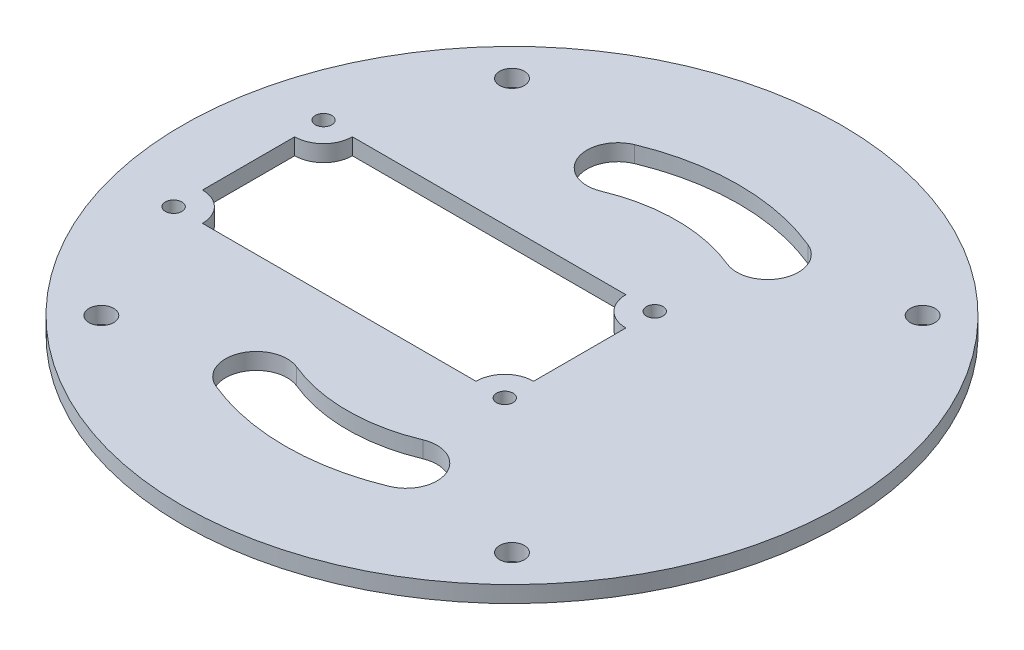
ISO-10303-21;
HEADER;
FILE_DESCRIPTION(('STEP AP214'),'2;1');
FILE_NAME('part.step','',(''),(''),'','','');
FILE_SCHEMA(('AUTOMOTIVE_DESIGN { 1 0 10303 214 1 1 1 1 }'));
ENDSEC;
DATA;
#1=APPLICATION_CONTEXT('core data for automotive mechanical design processes');
#2=APPLICATION_PROTOCOL_DEFINITION('international standard','automotive_design',2000,#1);
#3=PRODUCT_CONTEXT('',#1,'mechanical');
#4=PRODUCT('Part','Part','',(#3));
#5=PRODUCT_RELATED_PRODUCT_CATEGORY('part','',(#4));
#6=PRODUCT_DEFINITION_FORMATION('','',#4);
#7=PRODUCT_DEFINITION_CONTEXT('part definition',#1,'design');
#8=PRODUCT_DEFINITION('design','',#6,#7);
#9=PRODUCT_DEFINITION_SHAPE('','',#8);
#10=(LENGTH_UNIT() NAMED_UNIT(*) SI_UNIT(.MILLI.,.METRE.));
#11=(NAMED_UNIT(*) PLANE_ANGLE_UNIT() SI_UNIT($,.RADIAN.));
#12=(NAMED_UNIT(*) SI_UNIT($,.STERADIAN.) SOLID_ANGLE_UNIT());
#13=UNCERTAINTY_MEASURE_WITH_UNIT(LENGTH_MEASURE(1.E-05),#10,'distance_accuracy_value','');
#14=(GEOMETRIC_REPRESENTATION_CONTEXT(3) GLOBAL_UNCERTAINTY_ASSIGNED_CONTEXT((#13)) GLOBAL_UNIT_ASSIGNED_CONTEXT((#10,
#11,#12)) REPRESENTATION_CONTEXT('',''));
#15=CARTESIAN_POINT('',(0.,0.,0.));
#16=DIRECTION('',(0.,0.,1.));
#17=DIRECTION('',(1.,0.,0.));
#18=AXIS2_PLACEMENT_3D('',#15,#16,#17);
#19=CARTESIAN_POINT('',(8.2234,2.,-9.1));
#20=DIRECTION('',(0.,-1.,0.));
#21=DIRECTION('',(0.,0.,-1.));
#22=AXIS2_PLACEMENT_3D('',#19,#20,#21);
#23=CYLINDRICAL_SURFACE('',#22,3.5);
#24=CARTESIAN_POINT('',(8.2234,0.,-9.1));
#25=DIRECTION('',(0.,1.,0.));
#26=DIRECTION('',(0.,0.,1.));
#27=AXIS2_PLACEMENT_3D('',#24,#25,#26);
#28=CIRCLE('',#27,3.5);
#29=CARTESIAN_POINT('',(8.2234,0.,-5.6));
#30=VERTEX_POINT('',#29);
#31=CARTESIAN_POINT('',(4.7234,0.,-9.1));
#32=VERTEX_POINT('',#31);
#33=EDGE_CURVE('E239',#30,#32,#28,.F.);
#34=ORIENTED_EDGE('',*,*,#33,.F.);
#35=DIRECTION('',(0.,-1.,0.));
#36=VECTOR('',#35,1.);
#37=CARTESIAN_POINT('',(8.2234,2.,-5.6));
#38=LINE('',#37,#36);
#39=CARTESIAN_POINT('',(8.2234,2.,-5.6));
#40=VERTEX_POINT('',#39);
#41=EDGE_CURVE('E11',#40,#30,#38,.T.);
#42=ORIENTED_EDGE('',*,*,#41,.F.);
#43=CARTESIAN_POINT('',(8.2234,2.,-9.1));
#44=DIRECTION('',(0.,1.,0.));
#45=DIRECTION('',(0.,0.,1.));
#46=AXIS2_PLACEMENT_3D('',#43,#44,#45);
#47=CIRCLE('',#46,3.5);
#48=CARTESIAN_POINT('',(4.7234,2.,-9.1));
#49=VERTEX_POINT('',#48);
#50=EDGE_CURVE('E330',#40,#49,#47,.F.);
#51=ORIENTED_EDGE('',*,*,#50,.T.);
#52=DIRECTION('',(0.,-1.,0.));
#53=VECTOR('',#52,1.);
#54=CARTESIAN_POINT('',(4.7234,2.,-9.1));
#55=LINE('',#54,#53);
#56=EDGE_CURVE('E112',#49,#32,#55,.T.);
#57=ORIENTED_EDGE('',*,*,#56,.T.);
#58=EDGE_LOOP('',(#34,#42,#51,#57));
#59=FACE_BOUND('',#58,.T.);
#60=ADVANCED_FACE('F34',(#59),#23,.T.);
#61=CARTESIAN_POINT('',(8.2234,2.,0.));
#62=DIRECTION('',(1.,0.,0.));
#63=DIRECTION('',(0.,0.,-1.));
#64=AXIS2_PLACEMENT_3D('',#61,#62,#63);
#65=PLANE('',#64);
#66=DIRECTION('',(0.,0.,1.));
#67=VECTOR('',#66,1.);
#68=CARTESIAN_POINT('',(8.2234,0.,0.));
#69=LINE('',#68,#67);
#70=CARTESIAN_POINT('',(8.2234,0.,5.6));
#71=VERTEX_POINT('',#70);
#72=EDGE_CURVE('E241',#30,#71,#69,.T.);
#73=ORIENTED_EDGE('',*,*,#72,.T.);
#74=DIRECTION('',(0.,-1.,0.));
#75=VECTOR('',#74,1.);
#76=CARTESIAN_POINT('',(8.2234,2.,5.6));
#77=LINE('',#76,#75);
#78=CARTESIAN_POINT('',(8.2234,2.,5.6));
#79=VERTEX_POINT('',#78);
#80=EDGE_CURVE('E44',#79,#71,#77,.T.);
#81=ORIENTED_EDGE('',*,*,#80,.F.);
#82=DIRECTION('',(0.,0.,1.));
#83=VECTOR('',#82,1.);
#84=CARTESIAN_POINT('',(8.2234,2.,0.));
#85=LINE('',#84,#83);
#86=EDGE_CURVE('E332',#40,#79,#85,.T.);
#87=ORIENTED_EDGE('',*,*,#86,.F.);
#88=ORIENTED_EDGE('',*,*,#41,.T.);
#89=EDGE_LOOP('',(#73,#81,#87,#88));
#90=FACE_BOUND('',#89,.T.);
#91=ADVANCED_FACE('F375',(#90),#65,.F.);
#92=CARTESIAN_POINT('',(8.2234,2.,9.1));
#93=DIRECTION('',(0.,-1.,0.));
#94=DIRECTION('',(0.,0.,-1.));
#95=AXIS2_PLACEMENT_3D('',#92,#93,#94);
#96=CYLINDRICAL_SURFACE('',#95,3.5);
#97=CARTESIAN_POINT('',(8.2234,0.,9.1));
#98=DIRECTION('',(0.,1.,0.));
#99=DIRECTION('',(0.,0.,1.));
#100=AXIS2_PLACEMENT_3D('',#97,#98,#99);
#101=CIRCLE('',#100,3.5);
#102=CARTESIAN_POINT('',(4.7234,0.,9.1));
#103=VERTEX_POINT('',#102);
#104=EDGE_CURVE('E244',#103,#71,#101,.F.);
#105=ORIENTED_EDGE('',*,*,#104,.F.);
#106=DIRECTION('',(0.,-1.,0.));
#107=VECTOR('',#106,1.);
#108=CARTESIAN_POINT('',(4.7234,2.,9.1));
#109=LINE('',#108,#107);
#110=CARTESIAN_POINT('',(4.7234,2.,9.1));
#111=VERTEX_POINT('',#110);
#112=EDGE_CURVE('E279',#111,#103,#109,.T.);
#113=ORIENTED_EDGE('',*,*,#112,.F.);
#114=CARTESIAN_POINT('',(8.2234,2.,9.1));
#115=DIRECTION('',(0.,1.,0.));
#116=DIRECTION('',(0.,0.,1.));
#117=AXIS2_PLACEMENT_3D('',#114,#115,#116);
#118=CIRCLE('',#117,3.5);
#119=EDGE_CURVE('E334',#111,#79,#118,.F.);
#120=ORIENTED_EDGE('',*,*,#119,.T.);
#121=ORIENTED_EDGE('',*,*,#80,.T.);
#122=EDGE_LOOP('',(#105,#113,#120,#121));
#123=FACE_BOUND('',#122,.T.);
#124=ADVANCED_FACE('F380',(#123),#96,.T.);
#125=CARTESIAN_POINT('',(0.,2.,9.1));
#126=DIRECTION('',(0.,0.,-1.));
#127=DIRECTION('',(-1.,0.,0.));
#128=AXIS2_PLACEMENT_3D('',#125,#126,#127);
#129=PLANE('',#128);
#130=DIRECTION('',(1.,0.,0.));
#131=VECTOR('',#130,1.);
#132=CARTESIAN_POINT('',(0.,0.,9.1));
#133=LINE('',#132,#131);
#134=CARTESIAN_POINT('',(-28.4766,0.,9.1));
#135=VERTEX_POINT('',#134);
#136=EDGE_CURVE('E247',#135,#103,#133,.T.);
#137=ORIENTED_EDGE('',*,*,#136,.F.);
#138=DIRECTION('',(0.,-1.,0.));
#139=VECTOR('',#138,1.);
#140=CARTESIAN_POINT('',(-28.4766,2.,9.1));
#141=LINE('',#140,#139);
#142=CARTESIAN_POINT('',(-28.4766,2.,9.1));
#143=VERTEX_POINT('',#142);
#144=EDGE_CURVE('E277',#143,#135,#141,.T.);
#145=ORIENTED_EDGE('',*,*,#144,.F.);
#146=DIRECTION('',(1.,0.,0.));
#147=VECTOR('',#146,1.);
#148=CARTESIAN_POINT('',(0.,2.,9.1));
#149=LINE('',#148,#147);
#150=EDGE_CURVE('E182',#143,#111,#149,.T.);
#151=ORIENTED_EDGE('',*,*,#150,.T.);
#152=ORIENTED_EDGE('',*,*,#112,.T.);
#153=EDGE_LOOP('',(#137,#145,#151,#152));
#154=FACE_BOUND('',#153,.T.);
#155=ADVANCED_FACE('F339',(#154),#129,.T.);
#156=CARTESIAN_POINT('',(-31.9766,2.,9.1));
#157=DIRECTION('',(0.,-1.,0.));
#158=DIRECTION('',(0.,0.,-1.));
#159=AXIS2_PLACEMENT_3D('',#156,#157,#158);
#160=CYLINDRICAL_SURFACE('',#159,3.5);
#161=CARTESIAN_POINT('',(-31.9766,0.,9.1));
#162=DIRECTION('',(0.,1.,0.));
#163=DIRECTION('',(0.,0.,1.));
#164=AXIS2_PLACEMENT_3D('',#161,#162,#163);
#165=CIRCLE('',#164,3.5);
#166=CARTESIAN_POINT('',(-31.9766,0.,5.6));
#167=VERTEX_POINT('',#166);
#168=EDGE_CURVE('E250',#167,#135,#165,.F.);
#169=ORIENTED_EDGE('',*,*,#168,.F.);
#170=DIRECTION('',(0.,-1.,0.));
#171=VECTOR('',#170,1.);
#172=CARTESIAN_POINT('',(-31.9766,2.,5.6));
#173=LINE('',#172,#171);
#174=CARTESIAN_POINT('',(-31.9766,2.,5.6));
#175=VERTEX_POINT('',#174);
#176=EDGE_CURVE('E168',#175,#167,#173,.T.);
#177=ORIENTED_EDGE('',*,*,#176,.F.);
#178=CARTESIAN_POINT('',(-31.9766,2.,9.1));
#179=DIRECTION('',(0.,1.,0.));
#180=DIRECTION('',(0.,0.,1.));
#181=AXIS2_PLACEMENT_3D('',#178,#179,#180);
#182=CIRCLE('',#181,3.5);
#183=EDGE_CURVE('E180',#175,#143,#182,.F.);
#184=ORIENTED_EDGE('',*,*,#183,.T.);
#185=ORIENTED_EDGE('',*,*,#144,.T.);
#186=EDGE_LOOP('',(#169,#177,#184,#185));
#187=FACE_BOUND('',#186,.T.);
#188=ADVANCED_FACE('F344',(#187),#160,.T.);
#189=CARTESIAN_POINT('',(-31.9766,2.,0.));
#190=DIRECTION('',(1.,0.,0.));
#191=DIRECTION('',(0.,0.,-1.));
#192=AXIS2_PLACEMENT_3D('',#189,#190,#191);
#193=PLANE('',#192);
#194=DIRECTION('',(0.,0.,1.));
#195=VECTOR('',#194,1.);
#196=CARTESIAN_POINT('',(-31.9766,0.,0.));
#197=LINE('',#196,#195);
#198=CARTESIAN_POINT('',(-31.9766,0.,-5.6));
#199=VERTEX_POINT('',#198);
#200=EDGE_CURVE('E165',#199,#167,#197,.T.);
#201=ORIENTED_EDGE('',*,*,#200,.F.);
#202=DIRECTION('',(0.,-1.,0.));
#203=VECTOR('',#202,1.);
#204=CARTESIAN_POINT('',(-31.9766,2.,-5.6));
#205=LINE('',#204,#203);
#206=CARTESIAN_POINT('',(-31.9766,2.,-5.6));
#207=VERTEX_POINT('',#206);
#208=EDGE_CURVE('E159',#207,#199,#205,.T.);
#209=ORIENTED_EDGE('',*,*,#208,.F.);
#210=DIRECTION('',(0.,0.,1.));
#211=VECTOR('',#210,1.);
#212=CARTESIAN_POINT('',(-31.9766,2.,0.));
#213=LINE('',#212,#211);
#214=EDGE_CURVE('E163',#207,#175,#213,.T.);
#215=ORIENTED_EDGE('',*,*,#214,.T.);
#216=ORIENTED_EDGE('',*,*,#176,.T.);
#217=EDGE_LOOP('',(#201,#209,#215,#216));
#218=FACE_BOUND('',#217,.T.);
#219=ADVANCED_FACE('F161',(#218),#193,.T.);
#220=CARTESIAN_POINT('',(-31.9766,2.,-9.1));
#221=DIRECTION('',(0.,-1.,0.));
#222=DIRECTION('',(0.,0.,-1.));
#223=AXIS2_PLACEMENT_3D('',#220,#221,#222);
#224=CYLINDRICAL_SURFACE('',#223,3.5);
#225=CARTESIAN_POINT('',(-31.9766,0.,-9.1));
#226=DIRECTION('',(0.,1.,0.));
#227=DIRECTION('',(0.,0.,1.));
#228=AXIS2_PLACEMENT_3D('',#225,#226,#227);
#229=CIRCLE('',#228,3.5);
#230=CARTESIAN_POINT('',(-28.4766,0.,-9.1));
#231=VERTEX_POINT('',#230);
#232=EDGE_CURVE('E254',#199,#231,#229,.T.);
#233=ORIENTED_EDGE('',*,*,#232,.T.);
#234=DIRECTION('',(0.,-1.,0.));
#235=VECTOR('',#234,1.);
#236=CARTESIAN_POINT('',(-28.4766,2.,-9.1));
#237=LINE('',#236,#235);
#238=CARTESIAN_POINT('',(-28.4766,2.,-9.1));
#239=VERTEX_POINT('',#238);
#240=EDGE_CURVE('E169',#239,#231,#237,.T.);
#241=ORIENTED_EDGE('',*,*,#240,.F.);
#242=CARTESIAN_POINT('',(-31.9766,2.,-9.1));
#243=DIRECTION('',(0.,1.,0.));
#244=DIRECTION('',(0.,0.,1.));
#245=AXIS2_PLACEMENT_3D('',#242,#243,#244);
#246=CIRCLE('',#245,3.5);
#247=EDGE_CURVE('E172',#207,#239,#246,.T.);
#248=ORIENTED_EDGE('',*,*,#247,.F.);
#249=ORIENTED_EDGE('',*,*,#208,.T.);
#250=EDGE_LOOP('',(#233,#241,#248,#249));
#251=FACE_BOUND('',#250,.T.);
#252=ADVANCED_FACE('F173',(#251),#224,.T.);
#253=CARTESIAN_POINT('',(9.08873151867076,2.,21.9421388971431));
#254=DIRECTION('',(0.,-1.,0.));
#255=DIRECTION('',(0.,0.,-1.));
#256=AXIS2_PLACEMENT_3D('',#253,#254,#255);
#257=CYLINDRICAL_SURFACE('',#256,3.74999999999999);
#258=CARTESIAN_POINT('',(9.08873151867076,0.,21.9421388971431));
#259=DIRECTION('',(0.,1.,0.));
#260=DIRECTION('',(0.,0.,1.));
#261=AXIS2_PLACEMENT_3D('',#258,#259,#260);
#262=CIRCLE('',#261,3.74999999999999);
#263=CARTESIAN_POINT('',(10.5237943900398,0.,25.4066871440605));
#264=VERTEX_POINT('',#263);
#265=CARTESIAN_POINT('',(7.65366864730169,0.,18.4775906502258));
#266=VERTEX_POINT('',#265);
#267=EDGE_CURVE('E227',#264,#266,#262,.T.);
#268=ORIENTED_EDGE('',*,*,#267,.F.);
#269=DIRECTION('',(0.,-1.,0.));
#270=VECTOR('',#269,1.);
#271=CARTESIAN_POINT('',(10.5237943900398,2.,25.4066871440605));
#272=LINE('',#271,#270);
#273=CARTESIAN_POINT('',(10.5237943900398,2.,25.4066871440605));
#274=VERTEX_POINT('',#273);
#275=EDGE_CURVE('E274',#274,#264,#272,.T.);
#276=ORIENTED_EDGE('',*,*,#275,.F.);
#277=CARTESIAN_POINT('',(9.08873151867076,2.,21.9421388971431));
#278=DIRECTION('',(0.,1.,0.));
#279=DIRECTION('',(0.,0.,1.));
#280=AXIS2_PLACEMENT_3D('',#277,#278,#279);
#281=CIRCLE('',#280,3.74999999999999);
#282=CARTESIAN_POINT('',(7.65366864730169,2.,18.4775906502258));
#283=VERTEX_POINT('',#282);
#284=EDGE_CURVE('E315',#274,#283,#281,.T.);
#285=ORIENTED_EDGE('',*,*,#284,.T.);
#286=DIRECTION('',(0.,-1.,0.));
#287=VECTOR('',#286,1.);
#288=CARTESIAN_POINT('',(7.65366864730169,2.,18.4775906502258));
#289=LINE('',#288,#287);
#290=EDGE_CURVE('E282',#283,#266,#289,.T.);
#291=ORIENTED_EDGE('',*,*,#290,.T.);
#292=EDGE_LOOP('',(#268,#276,#285,#291));
#293=FACE_BOUND('',#292,.T.);
#294=ADVANCED_FACE('F397',(#293),#257,.F.);
#295=CARTESIAN_POINT('',(0.,2.,0.));
#296=DIRECTION('',(0.,-1.,0.));
#297=DIRECTION('',(0.,0.,-1.));
#298=AXIS2_PLACEMENT_3D('',#295,#296,#297);
#299=CYLINDRICAL_SURFACE('',#298,27.5);
#300=CARTESIAN_POINT('',(0.,0.,0.));
#301=DIRECTION('',(0.,1.,0.));
#302=DIRECTION('',(0.,0.,1.));
#303=AXIS2_PLACEMENT_3D('',#300,#301,#302);
#304=CIRCLE('',#303,27.5);
#305=CARTESIAN_POINT('',(-10.5237943900398,0.,25.4066871440604));
#306=VERTEX_POINT('',#305);
#307=EDGE_CURVE('E230',#306,#264,#304,.T.);
#308=ORIENTED_EDGE('',*,*,#307,.F.);
#309=DIRECTION('',(0.,-1.,0.));
#310=VECTOR('',#309,1.);
#311=CARTESIAN_POINT('',(-10.5237943900398,2.,25.4066871440604));
#312=LINE('',#311,#310);
#313=CARTESIAN_POINT('',(-10.5237943900398,2.,25.4066871440604));
#314=VERTEX_POINT('',#313);
#315=EDGE_CURVE('E286',#314,#306,#312,.T.);
#316=ORIENTED_EDGE('',*,*,#315,.F.);
#317=CARTESIAN_POINT('',(0.,2.,0.));
#318=DIRECTION('',(0.,1.,0.));
#319=DIRECTION('',(0.,0.,1.));
#320=AXIS2_PLACEMENT_3D('',#317,#318,#319);
#321=CIRCLE('',#320,27.5);
#322=EDGE_CURVE('E318',#314,#274,#321,.T.);
#323=ORIENTED_EDGE('',*,*,#322,.T.);
#324=ORIENTED_EDGE('',*,*,#275,.T.);
#325=EDGE_LOOP('',(#308,#316,#323,#324));
#326=FACE_BOUND('',#325,.T.);
#327=ADVANCED_FACE('F393',(#326),#299,.F.);
#328=CARTESIAN_POINT('',(-9.08873151867075,2.,21.9421388971431));
#329=DIRECTION('',(0.,-1.,0.));
#330=DIRECTION('',(0.,0.,-1.));
#331=AXIS2_PLACEMENT_3D('',#328,#329,#330);
#332=CYLINDRICAL_SURFACE('',#331,3.74999999999999);
#333=CARTESIAN_POINT('',(-9.08873151867075,0.,21.9421388971431));
#334=DIRECTION('',(0.,1.,0.));
#335=DIRECTION('',(0.,0.,1.));
#336=AXIS2_PLACEMENT_3D('',#333,#334,#335);
#337=CIRCLE('',#336,3.74999999999999);
#338=CARTESIAN_POINT('',(-7.6536686473017,0.,18.4775906502258));
#339=VERTEX_POINT('',#338);
#340=EDGE_CURVE('E233',#339,#306,#337,.T.);
#341=ORIENTED_EDGE('',*,*,#340,.F.);
#342=DIRECTION('',(0.,-1.,0.));
#343=VECTOR('',#342,1.);
#344=CARTESIAN_POINT('',(-7.6536686473017,2.,18.4775906502258));
#345=LINE('',#344,#343);
#346=CARTESIAN_POINT('',(-7.6536686473017,2.,18.4775906502258));
#347=VERTEX_POINT('',#346);
#348=EDGE_CURVE('E284',#347,#339,#345,.T.);
#349=ORIENTED_EDGE('',*,*,#348,.F.);
#350=CARTESIAN_POINT('',(-9.08873151867075,2.,21.9421388971431));
#351=DIRECTION('',(0.,1.,0.));
#352=DIRECTION('',(0.,0.,1.));
#353=AXIS2_PLACEMENT_3D('',#350,#351,#352);
#354=CIRCLE('',#353,3.74999999999999);
#355=EDGE_CURVE('E325',#347,#314,#354,.T.);
#356=ORIENTED_EDGE('',*,*,#355,.T.);
#357=ORIENTED_EDGE('',*,*,#315,.T.);
#358=EDGE_LOOP('',(#341,#349,#356,#357));
#359=FACE_BOUND('',#358,.T.);
#360=ADVANCED_FACE('F390',(#359),#332,.F.);
#361=CARTESIAN_POINT('',(0.,2.,0.));
#362=DIRECTION('',(0.,-1.,0.));
#363=DIRECTION('',(0.,0.,-1.));
#364=AXIS2_PLACEMENT_3D('',#361,#362,#363);
#365=CYLINDRICAL_SURFACE('',#364,27.5);
#366=CARTESIAN_POINT('',(0.,0.,0.));
#367=DIRECTION('',(0.,1.,0.));
#368=DIRECTION('',(0.,0.,1.));
#369=AXIS2_PLACEMENT_3D('',#366,#367,#368);
#370=CIRCLE('',#369,27.5);
#371=CARTESIAN_POINT('',(10.5237943900398,0.,-25.4066871440604));
#372=VERTEX_POINT('',#371);
#373=CARTESIAN_POINT('',(-10.5237943900398,0.,-25.4066871440604));
#374=VERTEX_POINT('',#373);
#375=EDGE_CURVE('E215',#372,#374,#370,.T.);
#376=ORIENTED_EDGE('',*,*,#375,.F.);
#377=DIRECTION('',(0.,-1.,0.));
#378=VECTOR('',#377,1.);
#379=CARTESIAN_POINT('',(10.5237943900398,2.,-25.4066871440604));
#380=LINE('',#379,#378);
#381=CARTESIAN_POINT('',(10.5237943900398,2.,-25.4066871440604));
#382=VERTEX_POINT('',#381);
#383=EDGE_CURVE('E38',#382,#372,#380,.T.);
#384=ORIENTED_EDGE('',*,*,#383,.F.);
#385=CARTESIAN_POINT('',(0.,2.,0.));
#386=DIRECTION('',(0.,1.,0.));
#387=DIRECTION('',(0.,0.,1.));
#388=AXIS2_PLACEMENT_3D('',#385,#386,#387);
#389=CIRCLE('',#388,27.5);
#390=CARTESIAN_POINT('',(-10.5237943900398,2.,-25.4066871440604));
#391=VERTEX_POINT('',#390);
#392=EDGE_CURVE('E445',#382,#391,#389,.T.);
#393=ORIENTED_EDGE('',*,*,#392,.T.);
#394=DIRECTION('',(0.,-1.,0.));
#395=VECTOR('',#394,1.);
#396=CARTESIAN_POINT('',(-10.5237943900398,2.,-25.4066871440604));
#397=LINE('',#396,#395);
#398=EDGE_CURVE('E202',#391,#374,#397,.T.);
#399=ORIENTED_EDGE('',*,*,#398,.T.);
#400=EDGE_LOOP('',(#376,#384,#393,#399));
#401=FACE_BOUND('',#400,.T.);
#402=ADVANCED_FACE('F301',(#401),#365,.F.);
#403=CARTESIAN_POINT('',(9.08873151867076,2.,-21.9421388971431));
#404=DIRECTION('',(0.,-1.,0.));
#405=DIRECTION('',(0.,0.,-1.));
#406=AXIS2_PLACEMENT_3D('',#403,#404,#405);
#407=CYLINDRICAL_SURFACE('',#406,3.75);
#408=CARTESIAN_POINT('',(9.08873151867076,0.,-21.9421388971431));
#409=DIRECTION('',(0.,1.,0.));
#410=DIRECTION('',(0.,0.,1.));
#411=AXIS2_PLACEMENT_3D('',#408,#409,#410);
#412=CIRCLE('',#411,3.75);
#413=CARTESIAN_POINT('',(7.65366864730169,0.,-18.4775906502258));
#414=VERTEX_POINT('',#413);
#415=EDGE_CURVE('E218',#414,#372,#412,.T.);
#416=ORIENTED_EDGE('',*,*,#415,.F.);
#417=DIRECTION('',(0.,-1.,0.));
#418=VECTOR('',#417,1.);
#419=CARTESIAN_POINT('',(7.65366864730169,2.,-18.4775906502258));
#420=LINE('',#419,#418);
#421=CARTESIAN_POINT('',(7.65366864730169,2.,-18.4775906502258));
#422=VERTEX_POINT('',#421);
#423=EDGE_CURVE('E291',#422,#414,#420,.T.);
#424=ORIENTED_EDGE('',*,*,#423,.F.);
#425=CARTESIAN_POINT('',(9.08873151867076,2.,-21.9421388971431));
#426=DIRECTION('',(0.,1.,0.));
#427=DIRECTION('',(0.,0.,1.));
#428=AXIS2_PLACEMENT_3D('',#425,#426,#427);
#429=CIRCLE('',#428,3.75);
#430=EDGE_CURVE('E300',#422,#382,#429,.T.);
#431=ORIENTED_EDGE('',*,*,#430,.T.);
#432=ORIENTED_EDGE('',*,*,#383,.T.);
#433=EDGE_LOOP('',(#416,#424,#431,#432));
#434=FACE_BOUND('',#433,.T.);
#435=ADVANCED_FACE('F298',(#434),#407,.F.);
#436=CARTESIAN_POINT('',(0.,2.,0.));
#437=DIRECTION('',(0.,-1.,0.));
#438=DIRECTION('',(0.,0.,-1.));
#439=AXIS2_PLACEMENT_3D('',#436,#437,#438);
#440=CYLINDRICAL_SURFACE('',#439,20.);
#441=CARTESIAN_POINT('',(0.,0.,0.));
#442=DIRECTION('',(0.,1.,0.));
#443=DIRECTION('',(0.,0.,1.));
#444=AXIS2_PLACEMENT_3D('',#441,#442,#443);
#445=CIRCLE('',#444,20.);
#446=CARTESIAN_POINT('',(-7.65366864730169,0.,-18.4775906502258));
#447=VERTEX_POINT('',#446);
#448=EDGE_CURVE('E221',#414,#447,#445,.T.);
#449=ORIENTED_EDGE('',*,*,#448,.T.);
#450=DIRECTION('',(0.,-1.,0.));
#451=VECTOR('',#450,1.);
#452=CARTESIAN_POINT('',(-7.65366864730169,2.,-18.4775906502258));
#453=LINE('',#452,#451);
#454=CARTESIAN_POINT('',(-7.65366864730169,2.,-18.4775906502258));
#455=VERTEX_POINT('',#454);
#456=EDGE_CURVE('E290',#455,#447,#453,.T.);
#457=ORIENTED_EDGE('',*,*,#456,.F.);
#458=CARTESIAN_POINT('',(0.,2.,0.));
#459=DIRECTION('',(0.,1.,0.));
#460=DIRECTION('',(0.,0.,1.));
#461=AXIS2_PLACEMENT_3D('',#458,#459,#460);
#462=CIRCLE('',#461,20.);
#463=EDGE_CURVE('E309',#422,#455,#462,.T.);
#464=ORIENTED_EDGE('',*,*,#463,.F.);
#465=ORIENTED_EDGE('',*,*,#423,.T.);
#466=EDGE_LOOP('',(#449,#457,#464,#465));
#467=FACE_BOUND('',#466,.T.);
#468=ADVANCED_FACE('F307',(#467),#440,.T.);
#469=CARTESIAN_POINT('',(-31.9766,2.,-9.1));
#470=DIRECTION('',(0.,-1.,0.));
#471=DIRECTION('',(0.,0.,-1.));
#472=AXIS2_PLACEMENT_3D('',#469,#470,#471);
#473=CYLINDRICAL_SURFACE('',#472,0.995391994794667);
#474=CARTESIAN_POINT('',(-31.9766,2.,-9.1));
#475=DIRECTION('',(0.,1.,0.));
#476=DIRECTION('',(0.,0.,1.));
#477=AXIS2_PLACEMENT_3D('',#474,#475,#476);
#478=CIRCLE('',#477,0.995391994794667);
#479=CARTESIAN_POINT('',(-31.9766,2.,-8.10460800520533));
#480=VERTEX_POINT('',#479);
#481=EDGE_CURVE('E196',#480,#480,#478,.T.);
#482=ORIENTED_EDGE('',*,*,#481,.T.);
#483=EDGE_LOOP('',(#482));
#484=FACE_BOUND('',#483,.T.);
#485=CARTESIAN_POINT('',(-31.9766,0.,-9.1));
#486=DIRECTION('',(0.,1.,0.));
#487=DIRECTION('',(0.,0.,1.));
#488=AXIS2_PLACEMENT_3D('',#485,#486,#487);
#489=CIRCLE('',#488,0.995391994794667);
#490=CARTESIAN_POINT('',(-31.9766,0.,-8.10460800520533));
#491=VERTEX_POINT('',#490);
#492=EDGE_CURVE('E266',#491,#491,#489,.T.);
#493=ORIENTED_EDGE('',*,*,#492,.F.);
#494=EDGE_LOOP('',(#493));
#495=FACE_BOUND('',#494,.T.);
#496=ADVANCED_FACE('F407',(#484,#495),#473,.F.);
#497=CARTESIAN_POINT('',(-31.9766,2.,9.1));
#498=DIRECTION('',(0.,-1.,0.));
#499=DIRECTION('',(0.,0.,-1.));
#500=AXIS2_PLACEMENT_3D('',#497,#498,#499);
#501=CYLINDRICAL_SURFACE('',#500,1.00405552385071);
#502=CARTESIAN_POINT('',(-31.9766,2.,9.1));
#503=DIRECTION('',(0.,1.,0.));
#504=DIRECTION('',(0.,0.,1.));
#505=AXIS2_PLACEMENT_3D('',#502,#503,#504);
#506=CIRCLE('',#505,1.00405552385071);
#507=CARTESIAN_POINT('',(-31.9766,2.,10.1040555238507));
#508=VERTEX_POINT('',#507);
#509=EDGE_CURVE('E193',#508,#508,#506,.T.);
#510=ORIENTED_EDGE('',*,*,#509,.T.);
#511=EDGE_LOOP('',(#510));
#512=FACE_BOUND('',#511,.T.);
#513=CARTESIAN_POINT('',(-31.9766,0.,9.1));
#514=DIRECTION('',(0.,1.,0.));
#515=DIRECTION('',(0.,0.,1.));
#516=AXIS2_PLACEMENT_3D('',#513,#514,#515);
#517=CIRCLE('',#516,1.00405552385071);
#518=CARTESIAN_POINT('',(-31.9766,0.,10.1040555238507));
#519=VERTEX_POINT('',#518);
#520=EDGE_CURVE('E263',#519,#519,#517,.T.);
#521=ORIENTED_EDGE('',*,*,#520,.F.);
#522=EDGE_LOOP('',(#521));
#523=FACE_BOUND('',#522,.T.);
#524=ADVANCED_FACE('F537',(#512,#523),#501,.F.);
#525=CARTESIAN_POINT('',(8.2234,2.,-9.1));
#526=DIRECTION('',(0.,-1.,0.));
#527=DIRECTION('',(0.,0.,-1.));
#528=AXIS2_PLACEMENT_3D('',#525,#526,#527);
#529=CYLINDRICAL_SURFACE('',#528,1.0062267601255);
#530=CARTESIAN_POINT('',(8.2234,2.,-9.1));
#531=DIRECTION('',(0.,1.,0.));
#532=DIRECTION('',(0.,0.,1.));
#533=AXIS2_PLACEMENT_3D('',#530,#531,#532);
#534=CIRCLE('',#533,1.0062267601255);
#535=CARTESIAN_POINT('',(8.2234,2.,-8.0937732398745));
#536=VERTEX_POINT('',#535);
#537=EDGE_CURVE('E190',#536,#536,#534,.T.);
#538=ORIENTED_EDGE('',*,*,#537,.T.);
#539=EDGE_LOOP('',(#538));
#540=FACE_BOUND('',#539,.T.);
#541=CARTESIAN_POINT('',(8.2234,0.,-9.1));
#542=DIRECTION('',(0.,1.,0.));
#543=DIRECTION('',(0.,0.,1.));
#544=AXIS2_PLACEMENT_3D('',#541,#542,#543);
#545=CIRCLE('',#544,1.0062267601255);
#546=CARTESIAN_POINT('',(8.2234,0.,-8.0937732398745));
#547=VERTEX_POINT('',#546);
#548=EDGE_CURVE('E260',#547,#547,#545,.T.);
#549=ORIENTED_EDGE('',*,*,#548,.F.);
#550=EDGE_LOOP('',(#549));
#551=FACE_BOUND('',#550,.T.);
#552=ADVANCED_FACE('F528',(#540,#551),#529,.F.);
#553=CARTESIAN_POINT('',(8.2234,2.,9.1));
#554=DIRECTION('',(0.,-1.,0.));
#555=DIRECTION('',(0.,0.,-1.));
#556=AXIS2_PLACEMENT_3D('',#553,#554,#555);
#557=CYLINDRICAL_SURFACE('',#556,1.00464081275261);
#558=CARTESIAN_POINT('',(8.2234,2.,9.1));
#559=DIRECTION('',(0.,1.,0.));
#560=DIRECTION('',(0.,0.,1.));
#561=AXIS2_PLACEMENT_3D('',#558,#559,#560);
#562=CIRCLE('',#561,1.00464081275261);
#563=CARTESIAN_POINT('',(8.2234,2.,10.1046408127526));
#564=VERTEX_POINT('',#563);
#565=EDGE_CURVE('E187',#564,#564,#562,.T.);
#566=ORIENTED_EDGE('',*,*,#565,.T.);
#567=EDGE_LOOP('',(#566));
#568=FACE_BOUND('',#567,.T.);
#569=CARTESIAN_POINT('',(8.2234,0.,9.1));
#570=DIRECTION('',(0.,1.,0.));
#571=DIRECTION('',(0.,0.,1.));
#572=AXIS2_PLACEMENT_3D('',#569,#570,#571);
#573=CIRCLE('',#572,1.00464081275261);
#574=CARTESIAN_POINT('',(8.2234,0.,10.1046408127526));
#575=VERTEX_POINT('',#574);
#576=EDGE_CURVE('E257',#575,#575,#573,.T.);
#577=ORIENTED_EDGE('',*,*,#576,.F.);
#578=EDGE_LOOP('',(#577));
#579=FACE_BOUND('',#578,.T.);
#580=ADVANCED_FACE('F519',(#568,#579),#557,.F.);
#581=CARTESIAN_POINT('',(0.,2.,-9.1));
#582=DIRECTION('',(0.,0.,-1.));
#583=DIRECTION('',(-1.,0.,0.));
#584=AXIS2_PLACEMENT_3D('',#581,#582,#583);
#585=PLANE('',#584);
#586=DIRECTION('',(1.,0.,0.));
#587=VECTOR('',#586,1.);
#588=CARTESIAN_POINT('',(0.,0.,-9.1));
#589=LINE('',#588,#587);
#590=EDGE_CURVE('E105',#231,#32,#589,.T.);
#591=ORIENTED_EDGE('',*,*,#590,.T.);
#592=ORIENTED_EDGE('',*,*,#56,.F.);
#593=DIRECTION('',(1.,0.,0.));
#594=VECTOR('',#593,1.);
#595=CARTESIAN_POINT('',(0.,2.,-9.1));
#596=LINE('',#595,#594);
#597=EDGE_CURVE('E53',#239,#49,#596,.T.);
#598=ORIENTED_EDGE('',*,*,#597,.F.);
#599=ORIENTED_EDGE('',*,*,#240,.T.);
#600=EDGE_LOOP('',(#591,#592,#598,#599));
#601=FACE_BOUND('',#600,.T.);
#602=ADVANCED_FACE('F388',(#601),#585,.F.);
#603=CARTESIAN_POINT('',(0.,2.,0.));
#604=DIRECTION('',(0.,-1.,0.));
#605=DIRECTION('',(0.,0.,-1.));
#606=AXIS2_PLACEMENT_3D('',#603,#604,#605);
#607=CYLINDRICAL_SURFACE('',#606,20.);
#608=CARTESIAN_POINT('',(0.,0.,0.));
#609=DIRECTION('',(0.,1.,0.));
#610=DIRECTION('',(0.,0.,1.));
#611=AXIS2_PLACEMENT_3D('',#608,#609,#610);
#612=CIRCLE('',#611,20.);
#613=EDGE_CURVE('E236',#339,#266,#612,.T.);
#614=ORIENTED_EDGE('',*,*,#613,.T.);
#615=ORIENTED_EDGE('',*,*,#290,.F.);
#616=CARTESIAN_POINT('',(0.,2.,0.));
#617=DIRECTION('',(0.,1.,0.));
#618=DIRECTION('',(0.,0.,1.));
#619=AXIS2_PLACEMENT_3D('',#616,#617,#618);
#620=CIRCLE('',#619,20.);
#621=EDGE_CURVE('E328',#347,#283,#620,.T.);
#622=ORIENTED_EDGE('',*,*,#621,.F.);
#623=ORIENTED_EDGE('',*,*,#348,.T.);
#624=EDGE_LOOP('',(#614,#615,#622,#623));
#625=FACE_BOUND('',#624,.T.);
#626=ADVANCED_FACE('F385',(#625),#607,.T.);
#627=CARTESIAN_POINT('',(-9.08873151867075,2.,-21.9421388971431));
#628=DIRECTION('',(0.,-1.,0.));
#629=DIRECTION('',(0.,0.,-1.));
#630=AXIS2_PLACEMENT_3D('',#627,#628,#629);
#631=CYLINDRICAL_SURFACE('',#630,3.75);
#632=CARTESIAN_POINT('',(-9.08873151867075,0.,-21.9421388971431));
#633=DIRECTION('',(0.,1.,0.));
#634=DIRECTION('',(0.,0.,1.));
#635=AXIS2_PLACEMENT_3D('',#632,#633,#634);
#636=CIRCLE('',#635,3.75);
#637=EDGE_CURVE('E224',#374,#447,#636,.T.);
#638=ORIENTED_EDGE('',*,*,#637,.F.);
#639=ORIENTED_EDGE('',*,*,#398,.F.);
#640=CARTESIAN_POINT('',(-9.08873151867075,2.,-21.9421388971431));
#641=DIRECTION('',(0.,1.,0.));
#642=DIRECTION('',(0.,0.,1.));
#643=AXIS2_PLACEMENT_3D('',#640,#641,#642);
#644=CIRCLE('',#643,3.75);
#645=EDGE_CURVE('E312',#391,#455,#644,.T.);
#646=ORIENTED_EDGE('',*,*,#645,.T.);
#647=ORIENTED_EDGE('',*,*,#456,.T.);
#648=EDGE_LOOP('',(#638,#639,#646,#647));
#649=FACE_BOUND('',#648,.T.);
#650=ADVANCED_FACE('F313',(#649),#631,.F.);
#651=CARTESIAN_POINT('',(-24.9255140368259,2.,-24.9255140368257));
#652=DIRECTION('',(0.,-1.,0.));
#653=DIRECTION('',(0.,0.,-1.));
#654=AXIS2_PLACEMENT_3D('',#651,#652,#653);
#655=CYLINDRICAL_SURFACE('',#654,1.5);
#656=CARTESIAN_POINT('',(-24.9255140368259,2.,-24.9255140368257));
#657=DIRECTION('',(0.,1.,0.));
#658=DIRECTION('',(0.,0.,1.));
#659=AXIS2_PLACEMENT_3D('',#656,#657,#658);
#660=CIRCLE('',#659,1.5);
#661=CARTESIAN_POINT('',(-24.9255140368259,2.,-23.4255140368257));
#662=VERTEX_POINT('',#661);
#663=EDGE_CURVE('E438',#662,#662,#660,.T.);
#664=ORIENTED_EDGE('',*,*,#663,.T.);
#665=EDGE_LOOP('',(#664));
#666=FACE_BOUND('',#665,.T.);
#667=CARTESIAN_POINT('',(-24.9255140368259,0.,-24.9255140368257));
#668=DIRECTION('',(0.,1.,0.));
#669=DIRECTION('',(0.,0.,1.));
#670=AXIS2_PLACEMENT_3D('',#667,#668,#669);
#671=CIRCLE('',#670,1.5);
#672=CARTESIAN_POINT('',(-24.9255140368259,0.,-23.4255140368257));
#673=VERTEX_POINT('',#672);
#674=EDGE_CURVE('E212',#673,#673,#671,.T.);
#675=ORIENTED_EDGE('',*,*,#674,.F.);
#676=EDGE_LOOP('',(#675));
#677=FACE_BOUND('',#676,.T.);
#678=ADVANCED_FACE('F404',(#666,#677),#655,.F.);
#679=CARTESIAN_POINT('',(24.9255140368257,2.,-24.9255140368273));
#680=DIRECTION('',(0.,-1.,0.));
#681=DIRECTION('',(0.,0.,-1.));
#682=AXIS2_PLACEMENT_3D('',#679,#680,#681);
#683=CYLINDRICAL_SURFACE('',#682,1.50000000000145);
#684=CARTESIAN_POINT('',(24.9255140368257,2.,-24.9255140368273));
#685=DIRECTION('',(0.,1.,0.));
#686=DIRECTION('',(0.,0.,1.));
#687=AXIS2_PLACEMENT_3D('',#684,#685,#686);
#688=CIRCLE('',#687,1.50000000000145);
#689=CARTESIAN_POINT('',(24.9255140368257,2.,-23.4255140368259));
#690=VERTEX_POINT('',#689);
#691=EDGE_CURVE('E435',#690,#690,#688,.T.);
#692=ORIENTED_EDGE('',*,*,#691,.T.);
#693=EDGE_LOOP('',(#692));
#694=FACE_BOUND('',#693,.T.);
#695=CARTESIAN_POINT('',(24.9255140368257,0.,-24.9255140368273));
#696=DIRECTION('',(0.,1.,0.));
#697=DIRECTION('',(0.,0.,1.));
#698=AXIS2_PLACEMENT_3D('',#695,#696,#697);
#699=CIRCLE('',#698,1.50000000000145);
#700=CARTESIAN_POINT('',(24.9255140368257,0.,-23.4255140368259));
#701=VERTEX_POINT('',#700);
#702=EDGE_CURVE('E209',#701,#701,#699,.T.);
#703=ORIENTED_EDGE('',*,*,#702,.F.);
#704=EDGE_LOOP('',(#703));
#705=FACE_BOUND('',#704,.T.);
#706=ADVANCED_FACE('F414',(#694,#705),#683,.F.);
#707=CARTESIAN_POINT('',(24.9255140368273,2.,24.9255140368243));
#708=DIRECTION('',(0.,-1.,0.));
#709=DIRECTION('',(0.,0.,-1.));
#710=AXIS2_PLACEMENT_3D('',#707,#708,#709);
#711=CYLINDRICAL_SURFACE('',#710,1.50000000000197);
#712=CARTESIAN_POINT('',(24.9255140368273,2.,24.9255140368243));
#713=DIRECTION('',(0.,1.,0.));
#714=DIRECTION('',(0.,0.,1.));
#715=AXIS2_PLACEMENT_3D('',#712,#713,#714);
#716=CIRCLE('',#715,1.50000000000197);
#717=CARTESIAN_POINT('',(24.9255140368273,2.,26.4255140368262));
#718=VERTEX_POINT('',#717);
#719=EDGE_CURVE('E425',#718,#718,#716,.T.);
#720=ORIENTED_EDGE('',*,*,#719,.T.);
#721=EDGE_LOOP('',(#720));
#722=FACE_BOUND('',#721,.T.);
#723=CARTESIAN_POINT('',(24.9255140368273,0.,24.9255140368243));
#724=DIRECTION('',(0.,1.,0.));
#725=DIRECTION('',(0.,0.,1.));
#726=AXIS2_PLACEMENT_3D('',#723,#724,#725);
#727=CIRCLE('',#726,1.50000000000197);
#728=CARTESIAN_POINT('',(24.9255140368273,0.,26.4255140368262));
#729=VERTEX_POINT('',#728);
#730=EDGE_CURVE('E206',#729,#729,#727,.T.);
#731=ORIENTED_EDGE('',*,*,#730,.F.);
#732=EDGE_LOOP('',(#731));
#733=FACE_BOUND('',#732,.T.);
#734=ADVANCED_FACE('F370',(#722,#733),#711,.F.);
#735=CARTESIAN_POINT('',(-24.9255140368243,2.,24.9255140368259));
#736=DIRECTION('',(0.,-1.,0.));
#737=DIRECTION('',(0.,0.,-1.));
#738=AXIS2_PLACEMENT_3D('',#735,#736,#737);
#739=CYLINDRICAL_SURFACE('',#738,1.50000000000073);
#740=CARTESIAN_POINT('',(-24.9255140368243,2.,24.9255140368259));
#741=DIRECTION('',(0.,1.,0.));
#742=DIRECTION('',(0.,0.,1.));
#743=AXIS2_PLACEMENT_3D('',#740,#741,#742);
#744=CIRCLE('',#743,1.50000000000073);
#745=CARTESIAN_POINT('',(-24.9255140368243,2.,26.4255140368267));
#746=VERTEX_POINT('',#745);
#747=EDGE_CURVE('E272',#746,#746,#744,.T.);
#748=ORIENTED_EDGE('',*,*,#747,.T.);
#749=EDGE_LOOP('',(#748));
#750=FACE_BOUND('',#749,.T.);
#751=CARTESIAN_POINT('',(-24.9255140368243,0.,24.9255140368259));
#752=DIRECTION('',(0.,1.,0.));
#753=DIRECTION('',(0.,0.,1.));
#754=AXIS2_PLACEMENT_3D('',#751,#752,#753);
#755=CIRCLE('',#754,1.50000000000073);
#756=CARTESIAN_POINT('',(-24.9255140368243,0.,26.4255140368267));
#757=VERTEX_POINT('',#756);
#758=EDGE_CURVE('E203',#757,#757,#755,.T.);
#759=ORIENTED_EDGE('',*,*,#758,.F.);
#760=EDGE_LOOP('',(#759));
#761=FACE_BOUND('',#760,.T.);
#762=ADVANCED_FACE('F36',(#750,#761),#739,.F.);
#763=CARTESIAN_POINT('',(0.,2.,0.));
#764=DIRECTION('',(0.,-1.,0.));
#765=DIRECTION('',(0.,0.,-1.));
#766=AXIS2_PLACEMENT_3D('',#763,#764,#765);
#767=CYLINDRICAL_SURFACE('',#766,40.0059373413923);
#768=CARTESIAN_POINT('',(0.,2.,0.));
#769=DIRECTION('',(0.,1.,0.));
#770=DIRECTION('',(0.,0.,1.));
#771=AXIS2_PLACEMENT_3D('',#768,#769,#770);
#772=CIRCLE('',#771,40.0059373413923);
#773=CARTESIAN_POINT('',(0.,2.,40.0059373413923));
#774=VERTEX_POINT('',#773);
#775=EDGE_CURVE('E199',#774,#774,#772,.T.);
#776=ORIENTED_EDGE('',*,*,#775,.F.);
#777=EDGE_LOOP('',(#776));
#778=FACE_BOUND('',#777,.T.);
#779=CARTESIAN_POINT('',(0.,0.,0.));
#780=DIRECTION('',(0.,1.,0.));
#781=DIRECTION('',(0.,0.,1.));
#782=AXIS2_PLACEMENT_3D('',#779,#780,#781);
#783=CIRCLE('',#782,40.0059373413923);
#784=CARTESIAN_POINT('',(0.,0.,40.0059373413923));
#785=VERTEX_POINT('',#784);
#786=EDGE_CURVE('E269',#785,#785,#783,.T.);
#787=ORIENTED_EDGE('',*,*,#786,.T.);
#788=EDGE_LOOP('',(#787));
#789=FACE_BOUND('',#788,.T.);
#790=ADVANCED_FACE('F360',(#778,#789),#767,.T.);
#791=CARTESIAN_POINT('',(0.,2.,0.));
#792=DIRECTION('',(0.,1.,0.));
#793=DIRECTION('',(0.,0.,1.));
#794=AXIS2_PLACEMENT_3D('',#791,#792,#793);
#795=PLANE('',#794);
#796=ORIENTED_EDGE('',*,*,#747,.F.);
#797=EDGE_LOOP('',(#796));
#798=FACE_BOUND('',#797,.T.);
#799=ORIENTED_EDGE('',*,*,#719,.F.);
#800=EDGE_LOOP('',(#799));
#801=FACE_BOUND('',#800,.T.);
#802=ORIENTED_EDGE('',*,*,#691,.F.);
#803=EDGE_LOOP('',(#802));
#804=FACE_BOUND('',#803,.T.);
#805=ORIENTED_EDGE('',*,*,#663,.F.);
#806=EDGE_LOOP('',(#805));
#807=FACE_BOUND('',#806,.T.);
#808=ORIENTED_EDGE('',*,*,#392,.F.);
#809=ORIENTED_EDGE('',*,*,#430,.F.);
#810=ORIENTED_EDGE('',*,*,#463,.T.);
#811=ORIENTED_EDGE('',*,*,#645,.F.);
#812=EDGE_LOOP('',(#808,#809,#810,#811));
#813=FACE_BOUND('',#812,.T.);
#814=ORIENTED_EDGE('',*,*,#284,.F.);
#815=ORIENTED_EDGE('',*,*,#322,.F.);
#816=ORIENTED_EDGE('',*,*,#355,.F.);
#817=ORIENTED_EDGE('',*,*,#621,.T.);
#818=EDGE_LOOP('',(#814,#815,#816,#817));
#819=FACE_BOUND('',#818,.T.);
#820=ORIENTED_EDGE('',*,*,#50,.F.);
#821=ORIENTED_EDGE('',*,*,#86,.T.);
#822=ORIENTED_EDGE('',*,*,#119,.F.);
#823=ORIENTED_EDGE('',*,*,#150,.F.);
#824=ORIENTED_EDGE('',*,*,#183,.F.);
#825=ORIENTED_EDGE('',*,*,#214,.F.);
#826=ORIENTED_EDGE('',*,*,#247,.T.);
#827=ORIENTED_EDGE('',*,*,#597,.T.);
#828=EDGE_LOOP('',(#820,#821,#822,#823,#824,#825,#826,#827));
#829=FACE_BOUND('',#828,.T.);
#830=ORIENTED_EDGE('',*,*,#565,.F.);
#831=EDGE_LOOP('',(#830));
#832=FACE_BOUND('',#831,.T.);
#833=ORIENTED_EDGE('',*,*,#537,.F.);
#834=EDGE_LOOP('',(#833));
#835=FACE_BOUND('',#834,.T.);
#836=ORIENTED_EDGE('',*,*,#509,.F.);
#837=EDGE_LOOP('',(#836));
#838=FACE_BOUND('',#837,.T.);
#839=ORIENTED_EDGE('',*,*,#481,.F.);
#840=EDGE_LOOP('',(#839));
#841=FACE_BOUND('',#840,.T.);
#842=ORIENTED_EDGE('',*,*,#775,.T.);
#843=EDGE_LOOP('',(#842));
#844=FACE_BOUND('',#843,.T.);
#845=ADVANCED_FACE('F176',(#798,#801,#804,#807,#813,#819,#829,#832,#835,#838,#841,#844),#795,.T.);
#846=CARTESIAN_POINT('',(0.,0.,0.));
#847=DIRECTION('',(0.,1.,0.));
#848=DIRECTION('',(0.,0.,1.));
#849=AXIS2_PLACEMENT_3D('',#846,#847,#848);
#850=PLANE('',#849);
#851=ORIENTED_EDGE('',*,*,#758,.T.);
#852=EDGE_LOOP('',(#851));
#853=FACE_BOUND('',#852,.T.);
#854=ORIENTED_EDGE('',*,*,#730,.T.);
#855=EDGE_LOOP('',(#854));
#856=FACE_BOUND('',#855,.T.);
#857=ORIENTED_EDGE('',*,*,#702,.T.);
#858=EDGE_LOOP('',(#857));
#859=FACE_BOUND('',#858,.T.);
#860=ORIENTED_EDGE('',*,*,#674,.T.);
#861=EDGE_LOOP('',(#860));
#862=FACE_BOUND('',#861,.T.);
#863=ORIENTED_EDGE('',*,*,#375,.T.);
#864=ORIENTED_EDGE('',*,*,#637,.T.);
#865=ORIENTED_EDGE('',*,*,#448,.F.);
#866=ORIENTED_EDGE('',*,*,#415,.T.);
#867=EDGE_LOOP('',(#863,#864,#865,#866));
#868=FACE_BOUND('',#867,.T.);
#869=ORIENTED_EDGE('',*,*,#267,.T.);
#870=ORIENTED_EDGE('',*,*,#613,.F.);
#871=ORIENTED_EDGE('',*,*,#340,.T.);
#872=ORIENTED_EDGE('',*,*,#307,.T.);
#873=EDGE_LOOP('',(#869,#870,#871,#872));
#874=FACE_BOUND('',#873,.T.);
#875=ORIENTED_EDGE('',*,*,#33,.T.);
#876=ORIENTED_EDGE('',*,*,#590,.F.);
#877=ORIENTED_EDGE('',*,*,#232,.F.);
#878=ORIENTED_EDGE('',*,*,#200,.T.);
#879=ORIENTED_EDGE('',*,*,#168,.T.);
#880=ORIENTED_EDGE('',*,*,#136,.T.);
#881=ORIENTED_EDGE('',*,*,#104,.T.);
#882=ORIENTED_EDGE('',*,*,#72,.F.);
#883=EDGE_LOOP('',(#875,#876,#877,#878,#879,#880,#881,#882));
#884=FACE_BOUND('',#883,.T.);
#885=ORIENTED_EDGE('',*,*,#576,.T.);
#886=EDGE_LOOP('',(#885));
#887=FACE_BOUND('',#886,.T.);
#888=ORIENTED_EDGE('',*,*,#548,.T.);
#889=EDGE_LOOP('',(#888));
#890=FACE_BOUND('',#889,.T.);
#891=ORIENTED_EDGE('',*,*,#520,.T.);
#892=EDGE_LOOP('',(#891));
#893=FACE_BOUND('',#892,.T.);
#894=ORIENTED_EDGE('',*,*,#492,.T.);
#895=EDGE_LOOP('',(#894));
#896=FACE_BOUND('',#895,.T.);
#897=ORIENTED_EDGE('',*,*,#786,.F.);
#898=EDGE_LOOP('',(#897));
#899=FACE_BOUND('',#898,.T.);
#900=ADVANCED_FACE('F304',(#853,#856,#859,#862,#868,#874,#884,#887,#890,#893,#896,#899),#850,.F.);
#901=CLOSED_SHELL('',(#60,#91,#124,#155,#188,#219,#252,#294,#327,#360,#402,#435,#468,#496,#524,
#552,#580,#602,#626,#650,#678,#706,#734,#762,#790,#845,#900));
#902=MANIFOLD_SOLID_BREP('B2',#901);
#903=ADVANCED_BREP_SHAPE_REPRESENTATION('',(#18,#902),#14);
#904=SHAPE_DEFINITION_REPRESENTATION(#9,#903);
ENDSEC;
END-ISO-10303-21;
